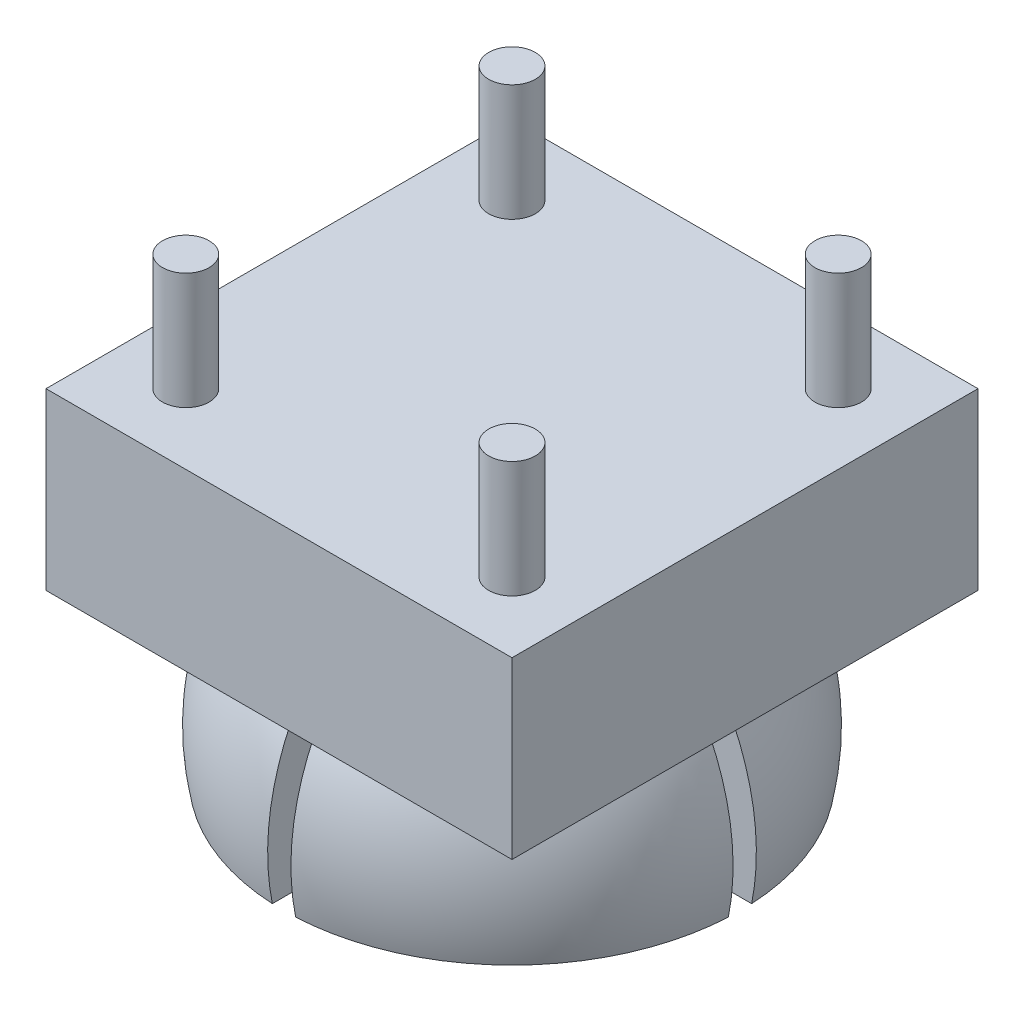
ISO-10303-21;
HEADER;
FILE_DESCRIPTION(('STEP AP214'),'2;1');
FILE_NAME('part.step','',(''),(''),'','','');
FILE_SCHEMA(('AUTOMOTIVE_DESIGN { 1 0 10303 214 1 1 1 1 }'));
ENDSEC;
DATA;
#1=APPLICATION_CONTEXT('core data for automotive mechanical design processes');
#2=APPLICATION_PROTOCOL_DEFINITION('international standard','automotive_design',2000,#1);
#3=PRODUCT_CONTEXT('',#1,'mechanical');
#4=PRODUCT('Part','Part','',(#3));
#5=PRODUCT_RELATED_PRODUCT_CATEGORY('part','',(#4));
#6=PRODUCT_DEFINITION_FORMATION('','',#4);
#7=PRODUCT_DEFINITION_CONTEXT('part definition',#1,'design');
#8=PRODUCT_DEFINITION('design','',#6,#7);
#9=PRODUCT_DEFINITION_SHAPE('','',#8);
#10=(LENGTH_UNIT() NAMED_UNIT(*) SI_UNIT(.MILLI.,.METRE.));
#11=(NAMED_UNIT(*) PLANE_ANGLE_UNIT() SI_UNIT($,.RADIAN.));
#12=(NAMED_UNIT(*) SI_UNIT($,.STERADIAN.) SOLID_ANGLE_UNIT());
#13=UNCERTAINTY_MEASURE_WITH_UNIT(LENGTH_MEASURE(1.E-05),#10,'distance_accuracy_value','');
#14=(GEOMETRIC_REPRESENTATION_CONTEXT(3) GLOBAL_UNCERTAINTY_ASSIGNED_CONTEXT((#13)) GLOBAL_UNIT_ASSIGNED_CONTEXT((#10,
#11,#12)) REPRESENTATION_CONTEXT('',''));
#15=CARTESIAN_POINT('',(0.,0.,0.));
#16=DIRECTION('',(0.,0.,1.));
#17=DIRECTION('',(1.,0.,0.));
#18=AXIS2_PLACEMENT_3D('',#15,#16,#17);
#19=CARTESIAN_POINT('',(4.80769230769231,-5.,-6.84294871794872));
#20=DIRECTION('',(0.,1.,0.));
#21=DIRECTION('',(1.,0.,0.));
#22=AXIS2_PLACEMENT_3D('',#19,#20,#21);
#23=SPHERICAL_SURFACE('',#22,10.);
#24=CARTESIAN_POINT('',(4.30769230769231,-5.,-6.84294871794872));
#25=DIRECTION('',(1.,0.,0.));
#26=DIRECTION('',(0.,0.,-1.));
#27=AXIS2_PLACEMENT_3D('',#24,#25,#26);
#28=CIRCLE('',#27,9.98749217771909);
#29=CARTESIAN_POINT('',(4.30769230769231,-7.,-16.6281416133392));
#30=VERTEX_POINT('',#29);
#31=CARTESIAN_POINT('',(4.30769230769231,0.,-15.488756950844));
#32=VERTEX_POINT('',#31);
#33=EDGE_CURVE('E275',#30,#32,#28,.T.);
#34=ORIENTED_EDGE('',*,*,#33,.F.);
#35=CARTESIAN_POINT('',(4.80769230769231,-7.,-6.84294871794872));
#36=DIRECTION('',(0.,1.,0.));
#37=DIRECTION('',(0.,0.,1.));
#38=AXIS2_PLACEMENT_3D('',#35,#36,#37);
#39=CIRCLE('',#38,9.79795897113271);
#40=CARTESIAN_POINT('',(-4.97750058769816,-7.,-7.34294871794872));
#41=VERTEX_POINT('',#40);
#42=EDGE_CURVE('E214',#30,#41,#39,.T.);
#43=ORIENTED_EDGE('',*,*,#42,.T.);
#44=CARTESIAN_POINT('',(4.80769230769231,-5.,-7.34294871794872));
#45=DIRECTION('',(0.,0.,1.));
#46=DIRECTION('',(1.,0.,0.));
#47=AXIS2_PLACEMENT_3D('',#44,#45,#46);
#48=CIRCLE('',#47,9.98749217771909);
#49=CARTESIAN_POINT('',(-3.83811592520299,0.,-7.34294871794872));
#50=VERTEX_POINT('',#49);
#51=EDGE_CURVE('E259',#50,#41,#48,.T.);
#52=ORIENTED_EDGE('',*,*,#51,.F.);
#53=CARTESIAN_POINT('',(4.80769230769231,0.,-6.84294871794872));
#54=DIRECTION('',(0.,-1.,0.));
#55=DIRECTION('',(0.,0.,-1.));
#56=AXIS2_PLACEMENT_3D('',#53,#54,#55);
#57=CIRCLE('',#56,8.66025403784439);
#58=EDGE_CURVE('E203',#32,#50,#57,.F.);
#59=ORIENTED_EDGE('',*,*,#58,.F.);
#60=EDGE_LOOP('',(#34,#43,#52,#59));
#61=FACE_BOUND('',#60,.T.);
#62=ADVANCED_FACE('F37',(#61),#23,.T.);
#63=CARTESIAN_POINT('',(0.,-7.,0.));
#64=DIRECTION('',(0.,1.,0.));
#65=DIRECTION('',(0.,0.,1.));
#66=AXIS2_PLACEMENT_3D('',#63,#64,#65);
#67=PLANE('',#66);
#68=DIRECTION('',(0.,0.,1.));
#69=VECTOR('',#68,1.);
#70=CARTESIAN_POINT('',(4.30769230769231,-7.,-16.8429487179487));
#71=LINE('',#70,#69);
#72=CARTESIAN_POINT('',(4.30769230769231,-7.,-14.5727611348189));
#73=VERTEX_POINT('',#72);
#74=EDGE_CURVE('E282',#30,#73,#71,.T.);
#75=ORIENTED_EDGE('',*,*,#74,.T.);
#76=CARTESIAN_POINT('',(4.80769230769231,-7.,-6.84294871794872));
#77=DIRECTION('',(0.,1.,0.));
#78=DIRECTION('',(0.,0.,1.));
#79=AXIS2_PLACEMENT_3D('',#76,#77,#78);
#80=CIRCLE('',#79,7.74596669241483);
#81=CARTESIAN_POINT('',(-2.92212010917785,-7.,-7.34294871794872));
#82=VERTEX_POINT('',#81);
#83=EDGE_CURVE('E227',#73,#82,#80,.T.);
#84=ORIENTED_EDGE('',*,*,#83,.T.);
#85=DIRECTION('',(1.,0.,0.));
#86=VECTOR('',#85,1.);
#87=CARTESIAN_POINT('',(-5.19230769230769,-7.,-7.34294871794872));
#88=LINE('',#87,#86);
#89=EDGE_CURVE('E272',#41,#82,#88,.T.);
#90=ORIENTED_EDGE('',*,*,#89,.F.);
#91=ORIENTED_EDGE('',*,*,#42,.F.);
#92=EDGE_LOOP('',(#75,#84,#90,#91));
#93=FACE_BOUND('',#92,.T.);
#94=ADVANCED_FACE('F318',(#93),#67,.F.);
#95=CARTESIAN_POINT('',(4.30769230769231,-5.,-6.84294871794872));
#96=DIRECTION('',(1.,0.,0.));
#97=DIRECTION('',(0.,0.,-1.));
#98=AXIS2_PLACEMENT_3D('',#95,#96,#97);
#99=CIRCLE('',#98,9.98749217771909);
#100=CARTESIAN_POINT('',(4.30769230769231,0.,1.80285951494657));
#101=VERTEX_POINT('',#100);
#102=CARTESIAN_POINT('',(4.30769230769231,-7.,2.94224417744175));
#103=VERTEX_POINT('',#102);
#104=EDGE_CURVE('E277',#101,#103,#99,.T.);
#105=ORIENTED_EDGE('',*,*,#104,.F.);
#106=CARTESIAN_POINT('',(-3.83811592520299,0.,-6.34294871794872));
#107=VERTEX_POINT('',#106);
#108=EDGE_CURVE('E200',#107,#101,#57,.F.);
#109=ORIENTED_EDGE('',*,*,#108,.F.);
#110=CARTESIAN_POINT('',(4.80769230769231,-5.,-6.34294871794872));
#111=DIRECTION('',(0.,0.,1.));
#112=DIRECTION('',(1.,0.,0.));
#113=AXIS2_PLACEMENT_3D('',#110,#111,#112);
#114=CIRCLE('',#113,9.98749217771909);
#115=CARTESIAN_POINT('',(-4.97750058769816,-7.,-6.34294871794872));
#116=VERTEX_POINT('',#115);
#117=EDGE_CURVE('E257',#107,#116,#114,.T.);
#118=ORIENTED_EDGE('',*,*,#117,.T.);
#119=EDGE_CURVE('E216',#116,#103,#39,.T.);
#120=ORIENTED_EDGE('',*,*,#119,.T.);
#121=EDGE_LOOP('',(#105,#109,#118,#120));
#122=FACE_BOUND('',#121,.T.);
#123=ADVANCED_FACE('F404',(#122),#23,.T.);
#124=CARTESIAN_POINT('',(4.30769230769231,-7.,0.886863698921434));
#125=VERTEX_POINT('',#124);
#126=EDGE_CURVE('E193',#125,#103,#71,.T.);
#127=ORIENTED_EDGE('',*,*,#126,.T.);
#128=ORIENTED_EDGE('',*,*,#119,.F.);
#129=DIRECTION('',(1.,0.,0.));
#130=VECTOR('',#129,1.);
#131=CARTESIAN_POINT('',(-5.19230769230769,-7.,-6.34294871794872));
#132=LINE('',#131,#130);
#133=CARTESIAN_POINT('',(-2.92212010917785,-7.,-6.34294871794872));
#134=VERTEX_POINT('',#133);
#135=EDGE_CURVE('E266',#116,#134,#132,.T.);
#136=ORIENTED_EDGE('',*,*,#135,.T.);
#137=EDGE_CURVE('E228',#134,#125,#80,.T.);
#138=ORIENTED_EDGE('',*,*,#137,.T.);
#139=EDGE_LOOP('',(#127,#128,#136,#138));
#140=FACE_BOUND('',#139,.T.);
#141=ADVANCED_FACE('F409',(#140),#67,.F.);
#142=CARTESIAN_POINT('',(4.80769230769231,-5.,-6.84294871794872));
#143=DIRECTION('',(0.,1.,0.));
#144=DIRECTION('',(1.,0.,0.));
#145=AXIS2_PLACEMENT_3D('',#142,#143,#144);
#146=SPHERICAL_SURFACE('',#145,8.);
#147=CARTESIAN_POINT('',(4.80769230769231,0.,-6.84294871794872));
#148=DIRECTION('',(0.,-1.,0.));
#149=DIRECTION('',(0.,0.,-1.));
#150=AXIS2_PLACEMENT_3D('',#147,#148,#149);
#151=CIRCLE('',#150,6.2449979983984);
#152=CARTESIAN_POINT('',(5.3076923076923,0.,-0.617998918954352));
#153=VERTEX_POINT('',#152);
#154=CARTESIAN_POINT('',(4.30769230769231,0.,-0.617998918954354));
#155=VERTEX_POINT('',#154);
#156=EDGE_CURVE('E46',#153,#155,#151,.T.);
#157=ORIENTED_EDGE('',*,*,#156,.T.);
#158=CARTESIAN_POINT('',(4.30769230769231,-5.,-6.84294871794872));
#159=DIRECTION('',(1.,0.,0.));
#160=DIRECTION('',(0.,0.,-1.));
#161=AXIS2_PLACEMENT_3D('',#158,#159,#160);
#162=CIRCLE('',#161,7.98435971133565);
#163=EDGE_CURVE('E11',#155,#125,#162,.T.);
#164=ORIENTED_EDGE('',*,*,#163,.T.);
#165=ORIENTED_EDGE('',*,*,#137,.F.);
#166=CARTESIAN_POINT('',(4.80769230769231,-5.,-6.34294871794872));
#167=DIRECTION('',(0.,0.,1.));
#168=DIRECTION('',(1.,0.,0.));
#169=AXIS2_PLACEMENT_3D('',#166,#167,#168);
#170=CIRCLE('',#169,7.98435971133565);
#171=CARTESIAN_POINT('',(-1.41725749130206,0.,-6.34294871794872));
#172=VERTEX_POINT('',#171);
#173=EDGE_CURVE('E303',#172,#134,#170,.T.);
#174=ORIENTED_EDGE('',*,*,#173,.F.);
#175=CARTESIAN_POINT('',(4.80769230769231,0.,-6.84294871794872));
#176=DIRECTION('',(0.,-1.,0.));
#177=DIRECTION('',(0.,0.,-1.));
#178=AXIS2_PLACEMENT_3D('',#175,#176,#177);
#179=CIRCLE('',#178,6.2449979983984);
#180=CARTESIAN_POINT('',(-1.41725749130206,0.,-7.34294871794872));
#181=VERTEX_POINT('',#180);
#182=EDGE_CURVE('E306',#172,#181,#179,.T.);
#183=ORIENTED_EDGE('',*,*,#182,.T.);
#184=CARTESIAN_POINT('',(4.80769230769231,-5.,-7.34294871794872));
#185=DIRECTION('',(0.,0.,1.));
#186=DIRECTION('',(1.,0.,0.));
#187=AXIS2_PLACEMENT_3D('',#184,#185,#186);
#188=CIRCLE('',#187,7.98435971133565);
#189=EDGE_CURVE('E326',#181,#82,#188,.T.);
#190=ORIENTED_EDGE('',*,*,#189,.T.);
#191=ORIENTED_EDGE('',*,*,#83,.F.);
#192=CARTESIAN_POINT('',(4.30769230769231,0.,-13.0678985169431));
#193=VERTEX_POINT('',#192);
#194=EDGE_CURVE('E41',#73,#193,#162,.T.);
#195=ORIENTED_EDGE('',*,*,#194,.T.);
#196=CARTESIAN_POINT('',(5.3076923076923,0.,-13.0678985169431));
#197=VERTEX_POINT('',#196);
#198=EDGE_CURVE('E302',#193,#197,#151,.T.);
#199=ORIENTED_EDGE('',*,*,#198,.T.);
#200=CARTESIAN_POINT('',(5.3076923076923,-5.,-6.84294871794872));
#201=DIRECTION('',(1.,0.,0.));
#202=DIRECTION('',(0.,0.,-1.));
#203=AXIS2_PLACEMENT_3D('',#200,#201,#202);
#204=CIRCLE('',#203,7.98435971133566);
#205=CARTESIAN_POINT('',(5.3076923076923,-7.,-14.5727611348189));
#206=VERTEX_POINT('',#205);
#207=EDGE_CURVE('E286',#206,#197,#204,.T.);
#208=ORIENTED_EDGE('',*,*,#207,.F.);
#209=CARTESIAN_POINT('',(12.5375047245625,-7.,-7.34294871794872));
#210=VERTEX_POINT('',#209);
#211=EDGE_CURVE('E225',#210,#206,#80,.T.);
#212=ORIENTED_EDGE('',*,*,#211,.F.);
#213=CARTESIAN_POINT('',(11.0326421066867,0.,-7.34294871794872));
#214=VERTEX_POINT('',#213);
#215=EDGE_CURVE('E297',#210,#214,#188,.T.);
#216=ORIENTED_EDGE('',*,*,#215,.T.);
#217=CARTESIAN_POINT('',(11.0326421066867,0.,-6.34294871794872));
#218=VERTEX_POINT('',#217);
#219=EDGE_CURVE('E293',#214,#218,#179,.T.);
#220=ORIENTED_EDGE('',*,*,#219,.T.);
#221=CARTESIAN_POINT('',(12.5375047245625,-7.,-6.34294871794872));
#222=VERTEX_POINT('',#221);
#223=EDGE_CURVE('E308',#222,#218,#170,.T.);
#224=ORIENTED_EDGE('',*,*,#223,.F.);
#225=CARTESIAN_POINT('',(5.3076923076923,-7.,0.886863698921436));
#226=VERTEX_POINT('',#225);
#227=EDGE_CURVE('E232',#226,#222,#80,.T.);
#228=ORIENTED_EDGE('',*,*,#227,.F.);
#229=EDGE_CURVE('E305',#153,#226,#204,.T.);
#230=ORIENTED_EDGE('',*,*,#229,.F.);
#231=EDGE_LOOP('',(#157,#164,#165,#174,#183,#190,#191,#195,#199,#208,#212,#216,#220,#224,#228,#230));
#232=FACE_BOUND('',#231,.T.);
#233=ADVANCED_FACE('F300',(#232),#146,.F.);
#234=CARTESIAN_POINT('',(14.5928852030828,-7.,-7.34294871794872));
#235=VERTEX_POINT('',#234);
#236=CARTESIAN_POINT('',(5.3076923076923,-7.,-16.6281416133392));
#237=VERTEX_POINT('',#236);
#238=EDGE_CURVE('E208',#235,#237,#39,.T.);
#239=ORIENTED_EDGE('',*,*,#238,.T.);
#240=CARTESIAN_POINT('',(5.3076923076923,-5.,-6.84294871794872));
#241=DIRECTION('',(1.,0.,0.));
#242=DIRECTION('',(0.,0.,-1.));
#243=AXIS2_PLACEMENT_3D('',#240,#241,#242);
#244=CIRCLE('',#243,9.98749217771909);
#245=CARTESIAN_POINT('',(5.3076923076923,0.,-15.488756950844));
#246=VERTEX_POINT('',#245);
#247=EDGE_CURVE('E180',#237,#246,#244,.T.);
#248=ORIENTED_EDGE('',*,*,#247,.T.);
#249=CARTESIAN_POINT('',(13.4535005405876,0.,-7.34294871794872));
#250=VERTEX_POINT('',#249);
#251=EDGE_CURVE('E201',#250,#246,#57,.F.);
#252=ORIENTED_EDGE('',*,*,#251,.F.);
#253=EDGE_CURVE('E260',#235,#250,#48,.T.);
#254=ORIENTED_EDGE('',*,*,#253,.F.);
#255=EDGE_LOOP('',(#239,#248,#252,#254));
#256=FACE_BOUND('',#255,.T.);
#257=ADVANCED_FACE('F289',(#256),#23,.T.);
#258=ORIENTED_EDGE('',*,*,#211,.T.);
#259=DIRECTION('',(0.,0.,1.));
#260=VECTOR('',#259,1.);
#261=CARTESIAN_POINT('',(5.3076923076923,-7.,-16.8429487179487));
#262=LINE('',#261,#260);
#263=EDGE_CURVE('E61',#237,#206,#262,.T.);
#264=ORIENTED_EDGE('',*,*,#263,.F.);
#265=ORIENTED_EDGE('',*,*,#238,.F.);
#266=EDGE_CURVE('E273',#210,#235,#88,.T.);
#267=ORIENTED_EDGE('',*,*,#266,.F.);
#268=EDGE_LOOP('',(#258,#264,#265,#267));
#269=FACE_BOUND('',#268,.T.);
#270=ADVANCED_FACE('F298',(#269),#67,.F.);
#271=CARTESIAN_POINT('',(0.,0.,0.));
#272=DIRECTION('',(0.,-1.,0.));
#273=DIRECTION('',(0.,0.,-1.));
#274=AXIS2_PLACEMENT_3D('',#271,#272,#273);
#275=PLANE('',#274);
#276=ORIENTED_EDGE('',*,*,#251,.T.);
#277=DIRECTION('',(0.,0.,-1.));
#278=VECTOR('',#277,1.);
#279=CARTESIAN_POINT('',(5.3076923076923,0.,-16.8429487179487));
#280=LINE('',#279,#278);
#281=EDGE_CURVE('E194',#197,#246,#280,.T.);
#282=ORIENTED_EDGE('',*,*,#281,.F.);
#283=ORIENTED_EDGE('',*,*,#198,.F.);
#284=DIRECTION('',(0.,0.,-1.));
#285=VECTOR('',#284,1.);
#286=CARTESIAN_POINT('',(4.30769230769231,0.,-16.8429487179487));
#287=LINE('',#286,#285);
#288=EDGE_CURVE('E280',#193,#32,#287,.T.);
#289=ORIENTED_EDGE('',*,*,#288,.T.);
#290=ORIENTED_EDGE('',*,*,#58,.T.);
#291=DIRECTION('',(-1.,0.,0.));
#292=VECTOR('',#291,1.);
#293=CARTESIAN_POINT('',(-5.1923076923077,0.,-7.34294871794872));
#294=LINE('',#293,#292);
#295=EDGE_CURVE('E270',#181,#50,#294,.T.);
#296=ORIENTED_EDGE('',*,*,#295,.F.);
#297=ORIENTED_EDGE('',*,*,#182,.F.);
#298=DIRECTION('',(-1.,0.,0.));
#299=VECTOR('',#298,1.);
#300=CARTESIAN_POINT('',(-5.1923076923077,0.,-6.34294871794872));
#301=LINE('',#300,#299);
#302=EDGE_CURVE('E263',#172,#107,#301,.T.);
#303=ORIENTED_EDGE('',*,*,#302,.T.);
#304=ORIENTED_EDGE('',*,*,#108,.T.);
#305=EDGE_CURVE('E181',#101,#155,#287,.T.);
#306=ORIENTED_EDGE('',*,*,#305,.T.);
#307=ORIENTED_EDGE('',*,*,#156,.F.);
#308=CARTESIAN_POINT('',(5.3076923076923,0.,1.80285951494657));
#309=VERTEX_POINT('',#308);
#310=EDGE_CURVE('E53',#309,#153,#280,.T.);
#311=ORIENTED_EDGE('',*,*,#310,.F.);
#312=CARTESIAN_POINT('',(13.4535005405876,0.,-6.34294871794872));
#313=VERTEX_POINT('',#312);
#314=EDGE_CURVE('E188',#309,#313,#57,.F.);
#315=ORIENTED_EDGE('',*,*,#314,.T.);
#316=EDGE_CURVE('E262',#313,#218,#301,.T.);
#317=ORIENTED_EDGE('',*,*,#316,.T.);
#318=ORIENTED_EDGE('',*,*,#219,.F.);
#319=EDGE_CURVE('E269',#250,#214,#294,.T.);
#320=ORIENTED_EDGE('',*,*,#319,.F.);
#321=EDGE_LOOP('',(#276,#282,#283,#289,#290,#296,#297,#303,#304,#306,#307,#311,#315,#317,#318,#320));
#322=FACE_BOUND('',#321,.T.);
#323=DIRECTION('',(0.,0.,1.));
#324=VECTOR('',#323,1.);
#325=CARTESIAN_POINT('',(-5.1923076923077,0.,3.15705128205128));
#326=LINE('',#325,#324);
#327=CARTESIAN_POINT('',(-5.1923076923077,0.,-16.8429487179487));
#328=VERTEX_POINT('',#327);
#329=CARTESIAN_POINT('',(-5.1923076923077,0.,3.15705128205128));
#330=VERTEX_POINT('',#329);
#331=EDGE_CURVE('E205',#328,#330,#326,.T.);
#332=ORIENTED_EDGE('',*,*,#331,.F.);
#333=DIRECTION('',(-1.,0.,0.));
#334=VECTOR('',#333,1.);
#335=CARTESIAN_POINT('',(-5.1923076923077,0.,-16.8429487179487));
#336=LINE('',#335,#334);
#337=CARTESIAN_POINT('',(14.8076923076923,0.,-16.8429487179487));
#338=VERTEX_POINT('',#337);
#339=EDGE_CURVE('E361',#338,#328,#336,.T.);
#340=ORIENTED_EDGE('',*,*,#339,.F.);
#341=DIRECTION('',(0.,0.,-1.));
#342=VECTOR('',#341,1.);
#343=CARTESIAN_POINT('',(14.8076923076923,0.,3.15705128205128));
#344=LINE('',#343,#342);
#345=CARTESIAN_POINT('',(14.8076923076923,0.,3.15705128205128));
#346=VERTEX_POINT('',#345);
#347=EDGE_CURVE('E364',#346,#338,#344,.T.);
#348=ORIENTED_EDGE('',*,*,#347,.F.);
#349=DIRECTION('',(1.,0.,0.));
#350=VECTOR('',#349,1.);
#351=CARTESIAN_POINT('',(-5.1923076923077,0.,3.15705128205128));
#352=LINE('',#351,#350);
#353=EDGE_CURVE('E366',#330,#346,#352,.T.);
#354=ORIENTED_EDGE('',*,*,#353,.F.);
#355=EDGE_LOOP('',(#332,#340,#348,#354));
#356=FACE_BOUND('',#355,.T.);
#357=ADVANCED_FACE('F185',(#322,#356),#275,.T.);
#358=CARTESIAN_POINT('',(-5.1923076923077,7.5,3.15705128205128));
#359=DIRECTION('',(1.,0.,0.));
#360=DIRECTION('',(0.,0.,-1.));
#361=AXIS2_PLACEMENT_3D('',#358,#359,#360);
#362=PLANE('',#361);
#363=ORIENTED_EDGE('',*,*,#331,.T.);
#364=DIRECTION('',(0.,-1.,0.));
#365=VECTOR('',#364,1.);
#366=CARTESIAN_POINT('',(-5.1923076923077,7.5,3.15705128205128));
#367=LINE('',#366,#365);
#368=CARTESIAN_POINT('',(-5.1923076923077,7.5,3.15705128205128));
#369=VERTEX_POINT('',#368);
#370=EDGE_CURVE('E344',#369,#330,#367,.T.);
#371=ORIENTED_EDGE('',*,*,#370,.F.);
#372=DIRECTION('',(0.,0.,1.));
#373=VECTOR('',#372,1.);
#374=CARTESIAN_POINT('',(-5.1923076923077,7.5,3.15705128205128));
#375=LINE('',#374,#373);
#376=CARTESIAN_POINT('',(-5.1923076923077,7.5,-16.8429487179487));
#377=VERTEX_POINT('',#376);
#378=EDGE_CURVE('E363',#377,#369,#375,.T.);
#379=ORIENTED_EDGE('',*,*,#378,.F.);
#380=DIRECTION('',(0.,-1.,0.));
#381=VECTOR('',#380,1.);
#382=CARTESIAN_POINT('',(-5.1923076923077,7.5,-16.8429487179487));
#383=LINE('',#382,#381);
#384=EDGE_CURVE('E357',#377,#328,#383,.T.);
#385=ORIENTED_EDGE('',*,*,#384,.T.);
#386=EDGE_LOOP('',(#363,#371,#379,#385));
#387=FACE_BOUND('',#386,.T.);
#388=ADVANCED_FACE('F39',(#387),#362,.F.);
#389=CARTESIAN_POINT('',(-5.1923076923077,7.5,3.15705128205128));
#390=DIRECTION('',(0.,0.,-1.));
#391=DIRECTION('',(-1.,0.,0.));
#392=AXIS2_PLACEMENT_3D('',#389,#390,#391);
#393=PLANE('',#392);
#394=ORIENTED_EDGE('',*,*,#353,.T.);
#395=DIRECTION('',(0.,-1.,0.));
#396=VECTOR('',#395,1.);
#397=CARTESIAN_POINT('',(14.8076923076923,7.5,3.15705128205128));
#398=LINE('',#397,#396);
#399=CARTESIAN_POINT('',(14.8076923076923,7.5,3.15705128205128));
#400=VERTEX_POINT('',#399);
#401=EDGE_CURVE('E348',#400,#346,#398,.T.);
#402=ORIENTED_EDGE('',*,*,#401,.F.);
#403=DIRECTION('',(1.,0.,0.));
#404=VECTOR('',#403,1.);
#405=CARTESIAN_POINT('',(-5.1923076923077,7.5,3.15705128205128));
#406=LINE('',#405,#404);
#407=EDGE_CURVE('E372',#369,#400,#406,.T.);
#408=ORIENTED_EDGE('',*,*,#407,.F.);
#409=ORIENTED_EDGE('',*,*,#370,.T.);
#410=EDGE_LOOP('',(#394,#402,#408,#409));
#411=FACE_BOUND('',#410,.T.);
#412=ADVANCED_FACE('F385',(#411),#393,.F.);
#413=CARTESIAN_POINT('',(14.8076923076923,7.5,3.15705128205128));
#414=DIRECTION('',(-1.,0.,0.));
#415=DIRECTION('',(0.,0.,1.));
#416=AXIS2_PLACEMENT_3D('',#413,#414,#415);
#417=PLANE('',#416);
#418=ORIENTED_EDGE('',*,*,#347,.T.);
#419=DIRECTION('',(0.,-1.,0.));
#420=VECTOR('',#419,1.);
#421=CARTESIAN_POINT('',(14.8076923076923,7.5,-16.8429487179487));
#422=LINE('',#421,#420);
#423=CARTESIAN_POINT('',(14.8076923076923,7.5,-16.8429487179487));
#424=VERTEX_POINT('',#423);
#425=EDGE_CURVE('E352',#424,#338,#422,.T.);
#426=ORIENTED_EDGE('',*,*,#425,.F.);
#427=DIRECTION('',(0.,0.,-1.));
#428=VECTOR('',#427,1.);
#429=CARTESIAN_POINT('',(14.8076923076923,7.5,3.15705128205128));
#430=LINE('',#429,#428);
#431=EDGE_CURVE('E370',#400,#424,#430,.T.);
#432=ORIENTED_EDGE('',*,*,#431,.F.);
#433=ORIENTED_EDGE('',*,*,#401,.T.);
#434=EDGE_LOOP('',(#418,#426,#432,#433));
#435=FACE_BOUND('',#434,.T.);
#436=ADVANCED_FACE('F388',(#435),#417,.F.);
#437=CARTESIAN_POINT('',(-5.1923076923077,7.5,-16.8429487179487));
#438=DIRECTION('',(0.,0.,1.));
#439=DIRECTION('',(1.,0.,0.));
#440=AXIS2_PLACEMENT_3D('',#437,#438,#439);
#441=PLANE('',#440);
#442=ORIENTED_EDGE('',*,*,#339,.T.);
#443=ORIENTED_EDGE('',*,*,#384,.F.);
#444=DIRECTION('',(-1.,0.,0.));
#445=VECTOR('',#444,1.);
#446=CARTESIAN_POINT('',(-5.1923076923077,7.5,-16.8429487179487));
#447=LINE('',#446,#445);
#448=EDGE_CURVE('E360',#424,#377,#447,.T.);
#449=ORIENTED_EDGE('',*,*,#448,.F.);
#450=ORIENTED_EDGE('',*,*,#425,.T.);
#451=EDGE_LOOP('',(#442,#443,#449,#450));
#452=FACE_BOUND('',#451,.T.);
#453=ADVANCED_FACE('F391',(#452),#441,.F.);
#454=CARTESIAN_POINT('',(0.,7.5,0.));
#455=DIRECTION('',(0.,-1.,0.));
#456=DIRECTION('',(0.,0.,-1.));
#457=AXIS2_PLACEMENT_3D('',#454,#455,#456);
#458=PLANE('',#457);
#459=CARTESIAN_POINT('',(11.8076923076923,7.5,-13.8429487179487));
#460=DIRECTION('',(0.,-1.,0.));
#461=DIRECTION('',(0.,0.,-1.));
#462=AXIS2_PLACEMENT_3D('',#459,#460,#461);
#463=CIRCLE('',#462,1.);
#464=CARTESIAN_POINT('',(11.8076923076923,7.5,-14.8429487179487));
#465=VERTEX_POINT('',#464);
#466=EDGE_CURVE('E333',#465,#465,#463,.F.);
#467=ORIENTED_EDGE('',*,*,#466,.F.);
#468=EDGE_LOOP('',(#467));
#469=FACE_BOUND('',#468,.T.);
#470=CARTESIAN_POINT('',(11.8076923076923,7.5,0.157051282051282));
#471=DIRECTION('',(0.,-1.,0.));
#472=DIRECTION('',(0.,0.,-1.));
#473=AXIS2_PLACEMENT_3D('',#470,#471,#472);
#474=CIRCLE('',#473,1.);
#475=CARTESIAN_POINT('',(11.8076923076923,7.5,-0.84294871794872));
#476=VERTEX_POINT('',#475);
#477=EDGE_CURVE('E335',#476,#476,#474,.F.);
#478=ORIENTED_EDGE('',*,*,#477,.F.);
#479=EDGE_LOOP('',(#478));
#480=FACE_BOUND('',#479,.T.);
#481=CARTESIAN_POINT('',(-2.19230769230769,7.5,-13.8429487179487));
#482=DIRECTION('',(0.,-1.,0.));
#483=DIRECTION('',(0.,0.,-1.));
#484=AXIS2_PLACEMENT_3D('',#481,#482,#483);
#485=CIRCLE('',#484,1.);
#486=CARTESIAN_POINT('',(-2.19230769230769,7.5,-14.8429487179487));
#487=VERTEX_POINT('',#486);
#488=EDGE_CURVE('E340',#487,#487,#485,.F.);
#489=ORIENTED_EDGE('',*,*,#488,.F.);
#490=EDGE_LOOP('',(#489));
#491=FACE_BOUND('',#490,.T.);
#492=CARTESIAN_POINT('',(-2.19230769230769,7.5,0.157051282051283));
#493=DIRECTION('',(0.,-1.,0.));
#494=DIRECTION('',(0.,0.,-1.));
#495=AXIS2_PLACEMENT_3D('',#492,#493,#494);
#496=CIRCLE('',#495,1.);
#497=CARTESIAN_POINT('',(-2.19230769230769,7.5,-0.842948717948717));
#498=VERTEX_POINT('',#497);
#499=EDGE_CURVE('E342',#498,#498,#496,.F.);
#500=ORIENTED_EDGE('',*,*,#499,.F.);
#501=EDGE_LOOP('',(#500));
#502=FACE_BOUND('',#501,.T.);
#503=ORIENTED_EDGE('',*,*,#378,.T.);
#504=ORIENTED_EDGE('',*,*,#407,.T.);
#505=ORIENTED_EDGE('',*,*,#431,.T.);
#506=ORIENTED_EDGE('',*,*,#448,.T.);
#507=EDGE_LOOP('',(#503,#504,#505,#506));
#508=FACE_BOUND('',#507,.T.);
#509=ADVANCED_FACE('F376',(#469,#480,#491,#502,#508),#458,.F.);
#510=ORIENTED_EDGE('',*,*,#314,.F.);
#511=CARTESIAN_POINT('',(5.3076923076923,-5.,-6.84294871794872));
#512=DIRECTION('',(1.,0.,0.));
#513=DIRECTION('',(0.,0.,-1.));
#514=AXIS2_PLACEMENT_3D('',#511,#512,#513);
#515=CIRCLE('',#514,9.98749217771909);
#516=CARTESIAN_POINT('',(5.3076923076923,-7.,2.94224417744175));
#517=VERTEX_POINT('',#516);
#518=EDGE_CURVE('E173',#309,#517,#515,.T.);
#519=ORIENTED_EDGE('',*,*,#518,.T.);
#520=CARTESIAN_POINT('',(14.5928852030828,-7.,-6.34294871794872));
#521=VERTEX_POINT('',#520);
#522=EDGE_CURVE('E217',#517,#521,#39,.T.);
#523=ORIENTED_EDGE('',*,*,#522,.T.);
#524=EDGE_CURVE('E199',#521,#313,#114,.T.);
#525=ORIENTED_EDGE('',*,*,#524,.T.);
#526=EDGE_LOOP('',(#510,#519,#523,#525));
#527=FACE_BOUND('',#526,.T.);
#528=ADVANCED_FACE('F197',(#527),#23,.T.);
#529=ORIENTED_EDGE('',*,*,#522,.F.);
#530=EDGE_CURVE('E176',#226,#517,#262,.T.);
#531=ORIENTED_EDGE('',*,*,#530,.F.);
#532=ORIENTED_EDGE('',*,*,#227,.T.);
#533=EDGE_CURVE('E267',#222,#521,#132,.T.);
#534=ORIENTED_EDGE('',*,*,#533,.T.);
#535=EDGE_LOOP('',(#529,#531,#532,#534));
#536=FACE_BOUND('',#535,.T.);
#537=ADVANCED_FACE('F410',(#536),#67,.F.);
#538=CARTESIAN_POINT('',(-2.19230769230769,12.5,0.157051282051283));
#539=DIRECTION('',(0.,-1.,0.));
#540=DIRECTION('',(0.,0.,-1.));
#541=AXIS2_PLACEMENT_3D('',#538,#539,#540);
#542=CYLINDRICAL_SURFACE('',#541,1.);
#543=CARTESIAN_POINT('',(-2.19230769230769,12.5,0.157051282051283));
#544=DIRECTION('',(0.,1.,0.));
#545=DIRECTION('',(0.,0.,1.));
#546=AXIS2_PLACEMENT_3D('',#543,#544,#545);
#547=CIRCLE('',#546,1.);
#548=CARTESIAN_POINT('',(-2.19230769230769,12.5,1.15705128205128));
#549=VERTEX_POINT('',#548);
#550=EDGE_CURVE('E239',#549,#549,#547,.T.);
#551=ORIENTED_EDGE('',*,*,#550,.F.);
#552=EDGE_LOOP('',(#551));
#553=FACE_BOUND('',#552,.T.);
#554=ORIENTED_EDGE('',*,*,#499,.T.);
#555=EDGE_LOOP('',(#554));
#556=FACE_BOUND('',#555,.T.);
#557=ADVANCED_FACE('F418',(#553,#556),#542,.T.);
#558=CARTESIAN_POINT('',(-2.19230769230769,12.5,0.157051282051283));
#559=DIRECTION('',(0.,1.,0.));
#560=DIRECTION('',(0.,0.,1.));
#561=AXIS2_PLACEMENT_3D('',#558,#559,#560);
#562=PLANE('',#561);
#563=ORIENTED_EDGE('',*,*,#550,.T.);
#564=EDGE_LOOP('',(#563));
#565=FACE_BOUND('',#564,.T.);
#566=ADVANCED_FACE('F585',(#565),#562,.T.);
#567=CARTESIAN_POINT('',(-2.19230769230769,12.5,-13.8429487179487));
#568=DIRECTION('',(0.,-1.,0.));
#569=DIRECTION('',(0.,0.,-1.));
#570=AXIS2_PLACEMENT_3D('',#567,#568,#569);
#571=CYLINDRICAL_SURFACE('',#570,1.);
#572=CARTESIAN_POINT('',(-2.19230769230769,12.5,-13.8429487179487));
#573=DIRECTION('',(0.,1.,0.));
#574=DIRECTION('',(0.,0.,1.));
#575=AXIS2_PLACEMENT_3D('',#572,#573,#574);
#576=CIRCLE('',#575,1.);
#577=CARTESIAN_POINT('',(-2.19230769230769,12.5,-12.8429487179487));
#578=VERTEX_POINT('',#577);
#579=EDGE_CURVE('E245',#578,#578,#576,.T.);
#580=ORIENTED_EDGE('',*,*,#579,.F.);
#581=EDGE_LOOP('',(#580));
#582=FACE_BOUND('',#581,.T.);
#583=ORIENTED_EDGE('',*,*,#488,.T.);
#584=EDGE_LOOP('',(#583));
#585=FACE_BOUND('',#584,.T.);
#586=ADVANCED_FACE('F581',(#582,#585),#571,.T.);
#587=CARTESIAN_POINT('',(-2.19230769230769,12.5,-13.8429487179487));
#588=DIRECTION('',(0.,1.,0.));
#589=DIRECTION('',(0.,0.,1.));
#590=AXIS2_PLACEMENT_3D('',#587,#588,#589);
#591=PLANE('',#590);
#592=ORIENTED_EDGE('',*,*,#579,.T.);
#593=EDGE_LOOP('',(#592));
#594=FACE_BOUND('',#593,.T.);
#595=ADVANCED_FACE('F577',(#594),#591,.T.);
#596=CARTESIAN_POINT('',(11.8076923076923,12.5,0.157051282051282));
#597=DIRECTION('',(0.,-1.,0.));
#598=DIRECTION('',(0.,0.,-1.));
#599=AXIS2_PLACEMENT_3D('',#596,#597,#598);
#600=CYLINDRICAL_SURFACE('',#599,1.);
#601=CARTESIAN_POINT('',(11.8076923076923,12.5,0.157051282051282));
#602=DIRECTION('',(0.,1.,0.));
#603=DIRECTION('',(0.,0.,1.));
#604=AXIS2_PLACEMENT_3D('',#601,#602,#603);
#605=CIRCLE('',#604,1.);
#606=CARTESIAN_POINT('',(11.8076923076923,12.5,1.15705128205128));
#607=VERTEX_POINT('',#606);
#608=EDGE_CURVE('E249',#607,#607,#605,.T.);
#609=ORIENTED_EDGE('',*,*,#608,.F.);
#610=EDGE_LOOP('',(#609));
#611=FACE_BOUND('',#610,.T.);
#612=ORIENTED_EDGE('',*,*,#477,.T.);
#613=EDGE_LOOP('',(#612));
#614=FACE_BOUND('',#613,.T.);
#615=ADVANCED_FACE('F573',(#611,#614),#600,.T.);
#616=CARTESIAN_POINT('',(11.8076923076923,12.5,0.157051282051282));
#617=DIRECTION('',(0.,1.,0.));
#618=DIRECTION('',(0.,0.,1.));
#619=AXIS2_PLACEMENT_3D('',#616,#617,#618);
#620=PLANE('',#619);
#621=ORIENTED_EDGE('',*,*,#608,.T.);
#622=EDGE_LOOP('',(#621));
#623=FACE_BOUND('',#622,.T.);
#624=ADVANCED_FACE('F569',(#623),#620,.T.);
#625=CARTESIAN_POINT('',(11.8076923076923,12.5,-13.8429487179487));
#626=DIRECTION('',(0.,-1.,0.));
#627=DIRECTION('',(0.,0.,-1.));
#628=AXIS2_PLACEMENT_3D('',#625,#626,#627);
#629=CYLINDRICAL_SURFACE('',#628,1.);
#630=CARTESIAN_POINT('',(11.8076923076923,12.5,-13.8429487179487));
#631=DIRECTION('',(0.,1.,0.));
#632=DIRECTION('',(0.,0.,1.));
#633=AXIS2_PLACEMENT_3D('',#630,#631,#632);
#634=CIRCLE('',#633,1.);
#635=CARTESIAN_POINT('',(11.8076923076923,12.5,-12.8429487179487));
#636=VERTEX_POINT('',#635);
#637=EDGE_CURVE('E254',#636,#636,#634,.T.);
#638=ORIENTED_EDGE('',*,*,#637,.F.);
#639=EDGE_LOOP('',(#638));
#640=FACE_BOUND('',#639,.T.);
#641=ORIENTED_EDGE('',*,*,#466,.T.);
#642=EDGE_LOOP('',(#641));
#643=FACE_BOUND('',#642,.T.);
#644=ADVANCED_FACE('F565',(#640,#643),#629,.T.);
#645=CARTESIAN_POINT('',(11.8076923076923,12.5,-13.8429487179487));
#646=DIRECTION('',(0.,1.,0.));
#647=DIRECTION('',(0.,0.,1.));
#648=AXIS2_PLACEMENT_3D('',#645,#646,#647);
#649=PLANE('',#648);
#650=ORIENTED_EDGE('',*,*,#637,.T.);
#651=EDGE_LOOP('',(#650));
#652=FACE_BOUND('',#651,.T.);
#653=ADVANCED_FACE('F454',(#652),#649,.T.);
#654=CARTESIAN_POINT('',(0.,0.,-6.34294871794872));
#655=DIRECTION('',(0.,0.,1.));
#656=DIRECTION('',(1.,0.,0.));
#657=AXIS2_PLACEMENT_3D('',#654,#655,#656);
#658=PLANE('',#657);
#659=ORIENTED_EDGE('',*,*,#533,.F.);
#660=ORIENTED_EDGE('',*,*,#223,.T.);
#661=ORIENTED_EDGE('',*,*,#316,.F.);
#662=ORIENTED_EDGE('',*,*,#524,.F.);
#663=EDGE_LOOP('',(#659,#660,#661,#662));
#664=FACE_BOUND('',#663,.T.);
#665=ADVANCED_FACE('F449',(#664),#658,.F.);
#666=CARTESIAN_POINT('',(0.,0.,-7.34294871794872));
#667=DIRECTION('',(0.,0.,1.));
#668=DIRECTION('',(1.,0.,0.));
#669=AXIS2_PLACEMENT_3D('',#666,#667,#668);
#670=PLANE('',#669);
#671=ORIENTED_EDGE('',*,*,#253,.T.);
#672=ORIENTED_EDGE('',*,*,#319,.T.);
#673=ORIENTED_EDGE('',*,*,#215,.F.);
#674=ORIENTED_EDGE('',*,*,#266,.T.);
#675=EDGE_LOOP('',(#671,#672,#673,#674));
#676=FACE_BOUND('',#675,.T.);
#677=ADVANCED_FACE('F296',(#676),#670,.T.);
#678=ORIENTED_EDGE('',*,*,#302,.F.);
#679=ORIENTED_EDGE('',*,*,#173,.T.);
#680=ORIENTED_EDGE('',*,*,#135,.F.);
#681=ORIENTED_EDGE('',*,*,#117,.F.);
#682=EDGE_LOOP('',(#678,#679,#680,#681));
#683=FACE_BOUND('',#682,.T.);
#684=ADVANCED_FACE('F457',(#683),#658,.F.);
#685=ORIENTED_EDGE('',*,*,#51,.T.);
#686=ORIENTED_EDGE('',*,*,#89,.T.);
#687=ORIENTED_EDGE('',*,*,#189,.F.);
#688=ORIENTED_EDGE('',*,*,#295,.T.);
#689=EDGE_LOOP('',(#685,#686,#687,#688));
#690=FACE_BOUND('',#689,.T.);
#691=ADVANCED_FACE('F325',(#690),#670,.T.);
#692=CARTESIAN_POINT('',(5.3076923076923,0.,0.));
#693=DIRECTION('',(1.,0.,0.));
#694=DIRECTION('',(0.,0.,-1.));
#695=AXIS2_PLACEMENT_3D('',#692,#693,#694);
#696=PLANE('',#695);
#697=ORIENTED_EDGE('',*,*,#263,.T.);
#698=ORIENTED_EDGE('',*,*,#207,.T.);
#699=ORIENTED_EDGE('',*,*,#281,.T.);
#700=ORIENTED_EDGE('',*,*,#247,.F.);
#701=EDGE_LOOP('',(#697,#698,#699,#700));
#702=FACE_BOUND('',#701,.T.);
#703=ADVANCED_FACE('F285',(#702),#696,.F.);
#704=CARTESIAN_POINT('',(4.30769230769231,0.,0.));
#705=DIRECTION('',(1.,0.,0.));
#706=DIRECTION('',(0.,0.,-1.));
#707=AXIS2_PLACEMENT_3D('',#704,#705,#706);
#708=PLANE('',#707);
#709=ORIENTED_EDGE('',*,*,#33,.T.);
#710=ORIENTED_EDGE('',*,*,#288,.F.);
#711=ORIENTED_EDGE('',*,*,#194,.F.);
#712=ORIENTED_EDGE('',*,*,#74,.F.);
#713=EDGE_LOOP('',(#709,#710,#711,#712));
#714=FACE_BOUND('',#713,.T.);
#715=ADVANCED_FACE('F314',(#714),#708,.T.);
#716=ORIENTED_EDGE('',*,*,#104,.T.);
#717=ORIENTED_EDGE('',*,*,#126,.F.);
#718=ORIENTED_EDGE('',*,*,#163,.F.);
#719=ORIENTED_EDGE('',*,*,#305,.F.);
#720=EDGE_LOOP('',(#716,#717,#718,#719));
#721=FACE_BOUND('',#720,.T.);
#722=ADVANCED_FACE('F544',(#721),#708,.T.);
#723=ORIENTED_EDGE('',*,*,#310,.T.);
#724=ORIENTED_EDGE('',*,*,#229,.T.);
#725=ORIENTED_EDGE('',*,*,#530,.T.);
#726=ORIENTED_EDGE('',*,*,#518,.F.);
#727=EDGE_LOOP('',(#723,#724,#725,#726));
#728=FACE_BOUND('',#727,.T.);
#729=ADVANCED_FACE('F174',(#728),#696,.F.);
#730=CLOSED_SHELL('',(#62,#94,#123,#141,#233,#257,#270,#357,#388,#412,#436,#453,#509,#528,#537,
#557,#566,#586,#595,#615,#624,#644,#653,#665,#677,#684,#691,#703,#715,#722,#729));
#731=MANIFOLD_SOLID_BREP('B2',#730);
#732=ADVANCED_BREP_SHAPE_REPRESENTATION('',(#18,#731),#14);
#733=SHAPE_DEFINITION_REPRESENTATION(#9,#732);
ENDSEC;
END-ISO-10303-21;
